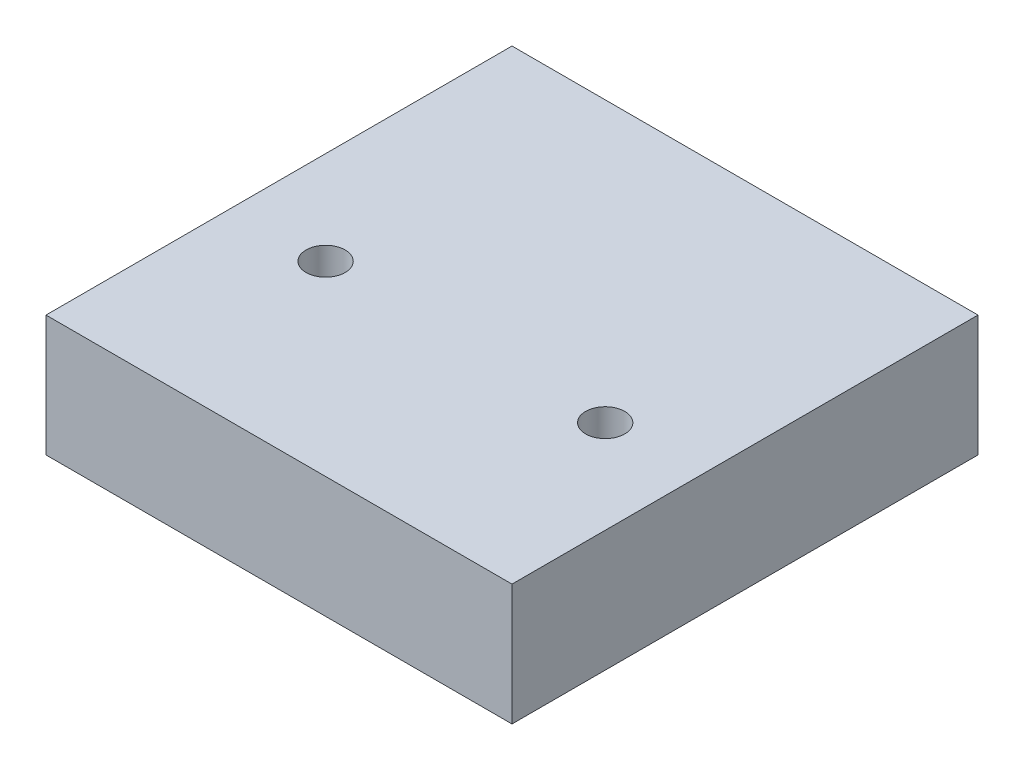
ISO-10303-21;
HEADER;
FILE_DESCRIPTION(('STEP AP214'),'2;1');
FILE_NAME('part.step','',(''),(''),'','','');
FILE_SCHEMA(('AUTOMOTIVE_DESIGN { 1 0 10303 214 1 1 1 1 }'));
ENDSEC;
DATA;
#1=APPLICATION_CONTEXT('core data for automotive mechanical design processes');
#2=APPLICATION_PROTOCOL_DEFINITION('international standard','automotive_design',2000,#1);
#3=PRODUCT_CONTEXT('',#1,'mechanical');
#4=PRODUCT('Part','Part','',(#3));
#5=PRODUCT_RELATED_PRODUCT_CATEGORY('part','',(#4));
#6=PRODUCT_DEFINITION_FORMATION('','',#4);
#7=PRODUCT_DEFINITION_CONTEXT('part definition',#1,'design');
#8=PRODUCT_DEFINITION('design','',#6,#7);
#9=PRODUCT_DEFINITION_SHAPE('','',#8);
#10=(LENGTH_UNIT() NAMED_UNIT(*) SI_UNIT(.MILLI.,.METRE.));
#11=(NAMED_UNIT(*) PLANE_ANGLE_UNIT() SI_UNIT($,.RADIAN.));
#12=(NAMED_UNIT(*) SI_UNIT($,.STERADIAN.) SOLID_ANGLE_UNIT());
#13=UNCERTAINTY_MEASURE_WITH_UNIT(LENGTH_MEASURE(1.E-05),#10,'distance_accuracy_value','');
#14=(GEOMETRIC_REPRESENTATION_CONTEXT(3) GLOBAL_UNCERTAINTY_ASSIGNED_CONTEXT((#13)) GLOBAL_UNIT_ASSIGNED_CONTEXT((#10,
#11,#12)) REPRESENTATION_CONTEXT('',''));
#15=CARTESIAN_POINT('',(0.,0.,0.));
#16=DIRECTION('',(0.,0.,1.));
#17=DIRECTION('',(1.,0.,0.));
#18=AXIS2_PLACEMENT_3D('',#15,#16,#17);
#19=CARTESIAN_POINT('',(25.,13.,25.));
#20=DIRECTION('',(-1.,0.,0.));
#21=DIRECTION('',(0.,0.,1.));
#22=AXIS2_PLACEMENT_3D('',#19,#20,#21);
#23=PLANE('',#22);
#24=DIRECTION('',(0.,0.,-1.));
#25=VECTOR('',#24,1.);
#26=CARTESIAN_POINT('',(25.,0.,25.));
#27=LINE('',#26,#25);
#28=CARTESIAN_POINT('',(25.,0.,25.));
#29=VERTEX_POINT('',#28);
#30=CARTESIAN_POINT('',(25.,0.,-25.));
#31=VERTEX_POINT('',#30);
#32=EDGE_CURVE('E102',#29,#31,#27,.T.);
#33=ORIENTED_EDGE('',*,*,#32,.T.);
#34=DIRECTION('',(0.,-1.,0.));
#35=VECTOR('',#34,1.);
#36=CARTESIAN_POINT('',(25.,13.,-25.));
#37=LINE('',#36,#35);
#38=CARTESIAN_POINT('',(25.,13.,-25.));
#39=VERTEX_POINT('',#38);
#40=EDGE_CURVE('E11',#39,#31,#37,.T.);
#41=ORIENTED_EDGE('',*,*,#40,.F.);
#42=DIRECTION('',(0.,0.,-1.));
#43=VECTOR('',#42,1.);
#44=CARTESIAN_POINT('',(25.,13.,25.));
#45=LINE('',#44,#43);
#46=CARTESIAN_POINT('',(25.,13.,25.));
#47=VERTEX_POINT('',#46);
#48=EDGE_CURVE('E90',#47,#39,#45,.T.);
#49=ORIENTED_EDGE('',*,*,#48,.F.);
#50=DIRECTION('',(0.,-1.,0.));
#51=VECTOR('',#50,1.);
#52=CARTESIAN_POINT('',(25.,13.,25.));
#53=LINE('',#52,#51);
#54=EDGE_CURVE('E98',#47,#29,#53,.T.);
#55=ORIENTED_EDGE('',*,*,#54,.T.);
#56=EDGE_LOOP('',(#33,#41,#49,#55));
#57=FACE_BOUND('',#56,.T.);
#58=ADVANCED_FACE('F39',(#57),#23,.F.);
#59=CARTESIAN_POINT('',(-25.,13.,-25.));
#60=DIRECTION('',(0.,0.,1.));
#61=DIRECTION('',(1.,0.,0.));
#62=AXIS2_PLACEMENT_3D('',#59,#60,#61);
#63=PLANE('',#62);
#64=DIRECTION('',(-1.,0.,0.));
#65=VECTOR('',#64,1.);
#66=CARTESIAN_POINT('',(-25.,0.,-25.));
#67=LINE('',#66,#65);
#68=CARTESIAN_POINT('',(-25.,0.,-25.));
#69=VERTEX_POINT('',#68);
#70=EDGE_CURVE('E94',#31,#69,#67,.T.);
#71=ORIENTED_EDGE('',*,*,#70,.T.);
#72=DIRECTION('',(0.,-1.,0.));
#73=VECTOR('',#72,1.);
#74=CARTESIAN_POINT('',(-25.,13.,-25.));
#75=LINE('',#74,#73);
#76=CARTESIAN_POINT('',(-25.,13.,-25.));
#77=VERTEX_POINT('',#76);
#78=EDGE_CURVE('E47',#77,#69,#75,.T.);
#79=ORIENTED_EDGE('',*,*,#78,.F.);
#80=DIRECTION('',(-1.,0.,0.));
#81=VECTOR('',#80,1.);
#82=CARTESIAN_POINT('',(-25.,13.,-25.));
#83=LINE('',#82,#81);
#84=EDGE_CURVE('E85',#39,#77,#83,.T.);
#85=ORIENTED_EDGE('',*,*,#84,.F.);
#86=ORIENTED_EDGE('',*,*,#40,.T.);
#87=EDGE_LOOP('',(#71,#79,#85,#86));
#88=FACE_BOUND('',#87,.T.);
#89=ADVANCED_FACE('F93',(#88),#63,.F.);
#90=CARTESIAN_POINT('',(-25.,13.,25.));
#91=DIRECTION('',(1.,0.,0.));
#92=DIRECTION('',(0.,0.,-1.));
#93=AXIS2_PLACEMENT_3D('',#90,#91,#92);
#94=PLANE('',#93);
#95=DIRECTION('',(0.,0.,1.));
#96=VECTOR('',#95,1.);
#97=CARTESIAN_POINT('',(-25.,0.,25.));
#98=LINE('',#97,#96);
#99=CARTESIAN_POINT('',(-25.,0.,25.));
#100=VERTEX_POINT('',#99);
#101=EDGE_CURVE('E72',#69,#100,#98,.T.);
#102=ORIENTED_EDGE('',*,*,#101,.T.);
#103=DIRECTION('',(0.,-1.,0.));
#104=VECTOR('',#103,1.);
#105=CARTESIAN_POINT('',(-25.,13.,25.));
#106=LINE('',#105,#104);
#107=CARTESIAN_POINT('',(-25.,13.,25.));
#108=VERTEX_POINT('',#107);
#109=EDGE_CURVE('E95',#108,#100,#106,.T.);
#110=ORIENTED_EDGE('',*,*,#109,.F.);
#111=DIRECTION('',(0.,0.,1.));
#112=VECTOR('',#111,1.);
#113=CARTESIAN_POINT('',(-25.,13.,25.));
#114=LINE('',#113,#112);
#115=EDGE_CURVE('E88',#77,#108,#114,.T.);
#116=ORIENTED_EDGE('',*,*,#115,.F.);
#117=ORIENTED_EDGE('',*,*,#78,.T.);
#118=EDGE_LOOP('',(#102,#110,#116,#117));
#119=FACE_BOUND('',#118,.T.);
#120=ADVANCED_FACE('F96',(#119),#94,.F.);
#121=CARTESIAN_POINT('',(-25.,13.,25.));
#122=DIRECTION('',(0.,0.,-1.));
#123=DIRECTION('',(-1.,0.,0.));
#124=AXIS2_PLACEMENT_3D('',#121,#122,#123);
#125=PLANE('',#124);
#126=DIRECTION('',(1.,0.,0.));
#127=VECTOR('',#126,1.);
#128=CARTESIAN_POINT('',(-25.,0.,25.));
#129=LINE('',#128,#127);
#130=EDGE_CURVE('E78',#100,#29,#129,.T.);
#131=ORIENTED_EDGE('',*,*,#130,.T.);
#132=ORIENTED_EDGE('',*,*,#54,.F.);
#133=DIRECTION('',(1.,0.,0.));
#134=VECTOR('',#133,1.);
#135=CARTESIAN_POINT('',(-25.,13.,25.));
#136=LINE('',#135,#134);
#137=EDGE_CURVE('E55',#108,#47,#136,.T.);
#138=ORIENTED_EDGE('',*,*,#137,.F.);
#139=ORIENTED_EDGE('',*,*,#109,.T.);
#140=EDGE_LOOP('',(#131,#132,#138,#139));
#141=FACE_BOUND('',#140,.T.);
#142=ADVANCED_FACE('F110',(#141),#125,.F.);
#143=CARTESIAN_POINT('',(0.,13.,0.));
#144=DIRECTION('',(0.,-1.,0.));
#145=DIRECTION('',(0.,0.,-1.));
#146=AXIS2_PLACEMENT_3D('',#143,#144,#145);
#147=PLANE('',#146);
#148=CARTESIAN_POINT('',(-15.,13.,5.));
#149=DIRECTION('',(0.,1.,0.));
#150=DIRECTION('',(0.,0.,1.));
#151=AXIS2_PLACEMENT_3D('',#148,#149,#150);
#152=CIRCLE('',#151,2.1);
#153=CARTESIAN_POINT('',(-15.,13.,7.1));
#154=VERTEX_POINT('',#153);
#155=EDGE_CURVE('E105',#154,#154,#152,.T.);
#156=ORIENTED_EDGE('',*,*,#155,.F.);
#157=EDGE_LOOP('',(#156));
#158=FACE_BOUND('',#157,.T.);
#159=CARTESIAN_POINT('',(15.,13.,5.));
#160=DIRECTION('',(0.,1.,0.));
#161=DIRECTION('',(0.,0.,1.));
#162=AXIS2_PLACEMENT_3D('',#159,#160,#161);
#163=CIRCLE('',#162,2.1);
#164=CARTESIAN_POINT('',(15.,13.,7.1));
#165=VERTEX_POINT('',#164);
#166=EDGE_CURVE('E116',#165,#165,#163,.T.);
#167=ORIENTED_EDGE('',*,*,#166,.F.);
#168=EDGE_LOOP('',(#167));
#169=FACE_BOUND('',#168,.T.);
#170=ORIENTED_EDGE('',*,*,#48,.T.);
#171=ORIENTED_EDGE('',*,*,#84,.T.);
#172=ORIENTED_EDGE('',*,*,#115,.T.);
#173=ORIENTED_EDGE('',*,*,#137,.T.);
#174=EDGE_LOOP('',(#170,#171,#172,#173));
#175=FACE_BOUND('',#174,.T.);
#176=ADVANCED_FACE('F86',(#158,#169,#175),#147,.F.);
#177=CARTESIAN_POINT('',(0.,0.,0.));
#178=DIRECTION('',(0.,-1.,0.));
#179=DIRECTION('',(0.,0.,-1.));
#180=AXIS2_PLACEMENT_3D('',#177,#178,#179);
#181=PLANE('',#180);
#182=CARTESIAN_POINT('',(-15.,0.,5.));
#183=DIRECTION('',(0.,-1.,0.));
#184=DIRECTION('',(0.,0.,-1.));
#185=AXIS2_PLACEMENT_3D('',#182,#183,#184);
#186=CIRCLE('',#185,2.1);
#187=CARTESIAN_POINT('',(-15.,0.,2.9));
#188=VERTEX_POINT('',#187);
#189=EDGE_CURVE('E122',#188,#188,#186,.F.);
#190=ORIENTED_EDGE('',*,*,#189,.T.);
#191=EDGE_LOOP('',(#190));
#192=FACE_BOUND('',#191,.T.);
#193=CARTESIAN_POINT('',(15.,0.,5.));
#194=DIRECTION('',(0.,-1.,0.));
#195=DIRECTION('',(0.,0.,-1.));
#196=AXIS2_PLACEMENT_3D('',#193,#194,#195);
#197=CIRCLE('',#196,2.1);
#198=CARTESIAN_POINT('',(15.,0.,2.9));
#199=VERTEX_POINT('',#198);
#200=EDGE_CURVE('E119',#199,#199,#197,.F.);
#201=ORIENTED_EDGE('',*,*,#200,.T.);
#202=EDGE_LOOP('',(#201));
#203=FACE_BOUND('',#202,.T.);
#204=ORIENTED_EDGE('',*,*,#32,.F.);
#205=ORIENTED_EDGE('',*,*,#130,.F.);
#206=ORIENTED_EDGE('',*,*,#101,.F.);
#207=ORIENTED_EDGE('',*,*,#70,.F.);
#208=EDGE_LOOP('',(#204,#205,#206,#207));
#209=FACE_BOUND('',#208,.T.);
#210=ADVANCED_FACE('F113',(#192,#203,#209),#181,.T.);
#211=CARTESIAN_POINT('',(15.,-0.000999999999999265,5.));
#212=DIRECTION('',(0.,1.,0.));
#213=DIRECTION('',(0.,0.,1.));
#214=AXIS2_PLACEMENT_3D('',#211,#212,#213);
#215=CYLINDRICAL_SURFACE('',#214,2.1);
#216=ORIENTED_EDGE('',*,*,#200,.F.);
#217=EDGE_LOOP('',(#216));
#218=FACE_BOUND('',#217,.T.);
#219=ORIENTED_EDGE('',*,*,#166,.T.);
#220=EDGE_LOOP('',(#219));
#221=FACE_BOUND('',#220,.T.);
#222=ADVANCED_FACE('F135',(#218,#221),#215,.F.);
#223=CARTESIAN_POINT('',(-15.,-0.000999999999999265,5.));
#224=DIRECTION('',(0.,1.,0.));
#225=DIRECTION('',(0.,0.,1.));
#226=AXIS2_PLACEMENT_3D('',#223,#224,#225);
#227=CYLINDRICAL_SURFACE('',#226,2.1);
#228=ORIENTED_EDGE('',*,*,#189,.F.);
#229=EDGE_LOOP('',(#228));
#230=FACE_BOUND('',#229,.T.);
#231=ORIENTED_EDGE('',*,*,#155,.T.);
#232=EDGE_LOOP('',(#231));
#233=FACE_BOUND('',#232,.T.);
#234=ADVANCED_FACE('F128',(#230,#233),#227,.F.);
#235=CLOSED_SHELL('',(#58,#89,#120,#142,#176,#210,#222,#234));
#236=MANIFOLD_SOLID_BREP('B2',#235);
#237=ADVANCED_BREP_SHAPE_REPRESENTATION('',(#18,#236),#14);
#238=SHAPE_DEFINITION_REPRESENTATION(#9,#237);
ENDSEC;
END-ISO-10303-21;
